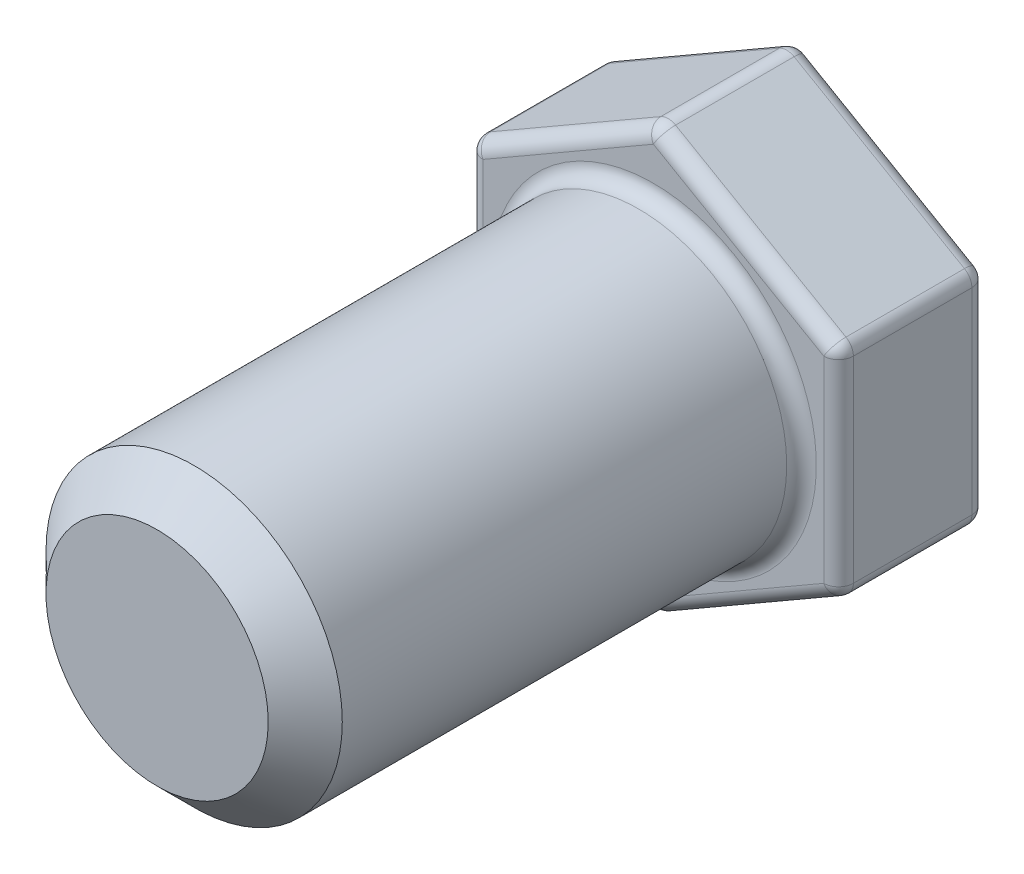
ISO-10303-21;
HEADER;
FILE_DESCRIPTION(('STEP AP214'),'2;1');
FILE_NAME('part.step','',(''),(''),'','','');
FILE_SCHEMA(('AUTOMOTIVE_DESIGN { 1 0 10303 214 1 1 1 1 }'));
ENDSEC;
DATA;
#1=APPLICATION_CONTEXT('core data for automotive mechanical design processes');
#2=APPLICATION_PROTOCOL_DEFINITION('international standard','automotive_design',2000,#1);
#3=PRODUCT_CONTEXT('',#1,'mechanical');
#4=PRODUCT('Part','Part','',(#3));
#5=PRODUCT_RELATED_PRODUCT_CATEGORY('part','',(#4));
#6=PRODUCT_DEFINITION_FORMATION('','',#4);
#7=PRODUCT_DEFINITION_CONTEXT('part definition',#1,'design');
#8=PRODUCT_DEFINITION('design','',#6,#7);
#9=PRODUCT_DEFINITION_SHAPE('','',#8);
#10=(LENGTH_UNIT() NAMED_UNIT(*) SI_UNIT(.MILLI.,.METRE.));
#11=(NAMED_UNIT(*) PLANE_ANGLE_UNIT() SI_UNIT($,.RADIAN.));
#12=(NAMED_UNIT(*) SI_UNIT($,.STERADIAN.) SOLID_ANGLE_UNIT());
#13=UNCERTAINTY_MEASURE_WITH_UNIT(LENGTH_MEASURE(1.E-05),#10,'distance_accuracy_value','');
#14=(GEOMETRIC_REPRESENTATION_CONTEXT(3) GLOBAL_UNCERTAINTY_ASSIGNED_CONTEXT((#13)) GLOBAL_UNIT_ASSIGNED_CONTEXT((#10,
#11,#12)) REPRESENTATION_CONTEXT('',''));
#15=CARTESIAN_POINT('',(0.,0.,0.));
#16=DIRECTION('',(0.,0.,1.));
#17=DIRECTION('',(1.,0.,0.));
#18=AXIS2_PLACEMENT_3D('',#15,#16,#17);
#19=CARTESIAN_POINT('',(0.,0.,6.7));
#20=DIRECTION('',(0.,0.,-1.));
#21=DIRECTION('',(-1.,0.,0.));
#22=AXIS2_PLACEMENT_3D('',#19,#20,#21);
#23=CYLINDRICAL_SURFACE('',#22,2.);
#24=CARTESIAN_POINT('',(0.,0.,6.2));
#25=DIRECTION('',(0.,0.,1.));
#26=DIRECTION('',(1.,0.,0.));
#27=AXIS2_PLACEMENT_3D('',#24,#25,#26);
#28=CIRCLE('',#27,2.);
#29=CARTESIAN_POINT('',(2.,0.,6.2));
#30=VERTEX_POINT('',#29);
#31=EDGE_CURVE('E11',#30,#30,#28,.F.);
#32=ORIENTED_EDGE('',*,*,#31,.T.);
#33=EDGE_LOOP('',(#32));
#34=FACE_BOUND('',#33,.T.);
#35=CARTESIAN_POINT('',(0.,0.,0.2));
#36=DIRECTION('',(0.,0.,-1.));
#37=DIRECTION('',(-1.,0.,0.));
#38=AXIS2_PLACEMENT_3D('',#35,#36,#37);
#39=CIRCLE('',#38,2.);
#40=CARTESIAN_POINT('',(-2.,0.,0.2));
#41=VERTEX_POINT('',#40);
#42=EDGE_CURVE('E768',#41,#41,#39,.F.);
#43=ORIENTED_EDGE('',*,*,#42,.T.);
#44=EDGE_LOOP('',(#43));
#45=FACE_BOUND('',#44,.T.);
#46=ADVANCED_FACE('F34',(#34,#45),#23,.T.);
#47=CARTESIAN_POINT('',(0.,0.,6.7));
#48=DIRECTION('',(0.,0.,1.));
#49=DIRECTION('',(1.,0.,0.));
#50=AXIS2_PLACEMENT_3D('',#47,#48,#49);
#51=PLANE('',#50);
#52=CARTESIAN_POINT('',(0.,0.,6.7));
#53=DIRECTION('',(0.,0.,1.));
#54=DIRECTION('',(1.,0.,0.));
#55=AXIS2_PLACEMENT_3D('',#52,#53,#54);
#56=CIRCLE('',#55,1.5);
#57=CARTESIAN_POINT('',(1.5,0.,6.7));
#58=VERTEX_POINT('',#57);
#59=EDGE_CURVE('E42',#58,#58,#56,.T.);
#60=ORIENTED_EDGE('',*,*,#59,.T.);
#61=EDGE_LOOP('',(#60));
#62=FACE_BOUND('',#61,.T.);
#63=ADVANCED_FACE('F296',(#62),#51,.T.);
#64=CARTESIAN_POINT('',(0.,2.88675134594813,-2.));
#65=DIRECTION('',(-0.5,-0.866025403784438,0.));
#66=DIRECTION('',(0.866025403784438,-0.5,0.));
#67=AXIS2_PLACEMENT_3D('',#64,#65,#66);
#68=PLANE('',#67);
#69=DIRECTION('',(0.866025403784438,-0.5,0.));
#70=VECTOR('',#69,1.);
#71=CARTESIAN_POINT('',(0.,2.88675134594813,-1.8));
#72=LINE('',#71,#70);
#73=CARTESIAN_POINT('',(2.4,1.50111069989303,-1.8));
#74=VERTEX_POINT('',#73);
#75=CARTESIAN_POINT('',(0.100000000000001,2.82901631902917,-1.8));
#76=VERTEX_POINT('',#75);
#77=EDGE_CURVE('E762',#74,#76,#72,.F.);
#78=ORIENTED_EDGE('',*,*,#77,.T.);
#79=DIRECTION('',(0.,0.,1.));
#80=VECTOR('',#79,1.);
#81=CARTESIAN_POINT('',(0.100000000000001,2.82901631902917,-2.));
#82=LINE('',#81,#80);
#83=CARTESIAN_POINT('',(0.100000000000001,2.82901631902917,-0.2));
#84=VERTEX_POINT('',#83);
#85=EDGE_CURVE('E241',#76,#84,#82,.T.);
#86=ORIENTED_EDGE('',*,*,#85,.T.);
#87=DIRECTION('',(0.866025403784438,-0.5,0.));
#88=VECTOR('',#87,1.);
#89=CARTESIAN_POINT('',(0.,2.88675134594813,-0.2));
#90=LINE('',#89,#88);
#91=CARTESIAN_POINT('',(2.4,1.50111069989303,-0.2));
#92=VERTEX_POINT('',#91);
#93=EDGE_CURVE('E779',#84,#92,#90,.T.);
#94=ORIENTED_EDGE('',*,*,#93,.T.);
#95=DIRECTION('',(0.,0.,1.));
#96=VECTOR('',#95,1.);
#97=CARTESIAN_POINT('',(2.4,1.50111069989303,-2.));
#98=LINE('',#97,#96);
#99=EDGE_CURVE('E239',#92,#74,#98,.F.);
#100=ORIENTED_EDGE('',*,*,#99,.T.);
#101=EDGE_LOOP('',(#78,#86,#94,#100));
#102=FACE_BOUND('',#101,.T.);
#103=ADVANCED_FACE('F314',(#102),#68,.F.);
#104=CARTESIAN_POINT('',(2.5,1.44337567297406,-2.));
#105=DIRECTION('',(-1.,0.,0.));
#106=DIRECTION('',(0.,-1.,0.));
#107=AXIS2_PLACEMENT_3D('',#104,#105,#106);
#108=PLANE('',#107);
#109=DIRECTION('',(0.,-1.,0.));
#110=VECTOR('',#109,1.);
#111=CARTESIAN_POINT('',(2.5,1.44337567297406,-0.2));
#112=LINE('',#111,#110);
#113=CARTESIAN_POINT('',(2.5,1.32790561913614,-0.2));
#114=VERTEX_POINT('',#113);
#115=CARTESIAN_POINT('',(2.5,-1.32790561913614,-0.2));
#116=VERTEX_POINT('',#115);
#117=EDGE_CURVE('E164',#114,#116,#112,.T.);
#118=ORIENTED_EDGE('',*,*,#117,.T.);
#119=DIRECTION('',(0.,0.,1.));
#120=VECTOR('',#119,1.);
#121=CARTESIAN_POINT('',(2.5,-1.32790561913614,-2.));
#122=LINE('',#121,#120);
#123=CARTESIAN_POINT('',(2.5,-1.32790561913614,-1.8));
#124=VERTEX_POINT('',#123);
#125=EDGE_CURVE('E260',#116,#124,#122,.F.);
#126=ORIENTED_EDGE('',*,*,#125,.T.);
#127=DIRECTION('',(0.,-1.,0.));
#128=VECTOR('',#127,1.);
#129=CARTESIAN_POINT('',(2.5,1.44337567297406,-1.8));
#130=LINE('',#129,#128);
#131=CARTESIAN_POINT('',(2.5,1.32790561913614,-1.8));
#132=VERTEX_POINT('',#131);
#133=EDGE_CURVE('E269',#124,#132,#130,.F.);
#134=ORIENTED_EDGE('',*,*,#133,.T.);
#135=DIRECTION('',(0.,0.,1.));
#136=VECTOR('',#135,1.);
#137=CARTESIAN_POINT('',(2.5,1.32790561913614,-2.));
#138=LINE('',#137,#136);
#139=EDGE_CURVE('E56',#132,#114,#138,.T.);
#140=ORIENTED_EDGE('',*,*,#139,.T.);
#141=EDGE_LOOP('',(#118,#126,#134,#140));
#142=FACE_BOUND('',#141,.T.);
#143=ADVANCED_FACE('F466',(#142),#108,.F.);
#144=CARTESIAN_POINT('',(2.5,-1.44337567297406,-2.));
#145=DIRECTION('',(-0.5,0.866025403784439,0.));
#146=DIRECTION('',(-0.866025403784439,-0.5,0.));
#147=AXIS2_PLACEMENT_3D('',#144,#145,#146);
#148=PLANE('',#147);
#149=DIRECTION('',(-0.866025403784439,-0.5,0.));
#150=VECTOR('',#149,1.);
#151=CARTESIAN_POINT('',(2.5,-1.44337567297406,-0.2));
#152=LINE('',#151,#150);
#153=CARTESIAN_POINT('',(2.4,-1.50111069989303,-0.2));
#154=VERTEX_POINT('',#153);
#155=CARTESIAN_POINT('',(0.0999999999999998,-2.82901631902917,-0.2));
#156=VERTEX_POINT('',#155);
#157=EDGE_CURVE('E799',#154,#156,#152,.T.);
#158=ORIENTED_EDGE('',*,*,#157,.T.);
#159=DIRECTION('',(0.,0.,1.));
#160=VECTOR('',#159,1.);
#161=CARTESIAN_POINT('',(0.0999999999999994,-2.82901631902917,-2.));
#162=LINE('',#161,#160);
#163=CARTESIAN_POINT('',(0.1,-2.82901631902917,-1.8));
#164=VERTEX_POINT('',#163);
#165=EDGE_CURVE('E257',#156,#164,#162,.F.);
#166=ORIENTED_EDGE('',*,*,#165,.T.);
#167=DIRECTION('',(-0.866025403784439,-0.5,0.));
#168=VECTOR('',#167,1.);
#169=CARTESIAN_POINT('',(2.5,-1.44337567297406,-1.8));
#170=LINE('',#169,#168);
#171=CARTESIAN_POINT('',(2.4,-1.50111069989303,-1.8));
#172=VERTEX_POINT('',#171);
#173=EDGE_CURVE('E192',#164,#172,#170,.F.);
#174=ORIENTED_EDGE('',*,*,#173,.T.);
#175=DIRECTION('',(0.,0.,1.));
#176=VECTOR('',#175,1.);
#177=CARTESIAN_POINT('',(2.4,-1.50111069989303,-2.));
#178=LINE('',#177,#176);
#179=EDGE_CURVE('E255',#172,#154,#178,.T.);
#180=ORIENTED_EDGE('',*,*,#179,.T.);
#181=EDGE_LOOP('',(#158,#166,#174,#180));
#182=FACE_BOUND('',#181,.T.);
#183=ADVANCED_FACE('F473',(#182),#148,.F.);
#184=CARTESIAN_POINT('',(0.,-2.88675134594813,-2.));
#185=DIRECTION('',(0.5,0.866025403784438,0.));
#186=DIRECTION('',(-0.866025403784438,0.5,0.));
#187=AXIS2_PLACEMENT_3D('',#184,#185,#186);
#188=PLANE('',#187);
#189=DIRECTION('',(-0.866025403784438,0.5,0.));
#190=VECTOR('',#189,1.);
#191=CARTESIAN_POINT('',(0.,-2.88675134594813,-0.2));
#192=LINE('',#191,#190);
#193=CARTESIAN_POINT('',(-0.1,-2.82901631902917,-0.2));
#194=VERTEX_POINT('',#193);
#195=CARTESIAN_POINT('',(-2.4,-1.50111069989303,-0.2));
#196=VERTEX_POINT('',#195);
#197=EDGE_CURVE('E793',#194,#196,#192,.T.);
#198=ORIENTED_EDGE('',*,*,#197,.T.);
#199=DIRECTION('',(0.,0.,1.));
#200=VECTOR('',#199,1.);
#201=CARTESIAN_POINT('',(-2.4,-1.50111069989303,-2.));
#202=LINE('',#201,#200);
#203=CARTESIAN_POINT('',(-2.4,-1.50111069989303,-1.8));
#204=VERTEX_POINT('',#203);
#205=EDGE_CURVE('E253',#196,#204,#202,.F.);
#206=ORIENTED_EDGE('',*,*,#205,.T.);
#207=DIRECTION('',(-0.866025403784438,0.5,0.));
#208=VECTOR('',#207,1.);
#209=CARTESIAN_POINT('',(0.,-2.88675134594813,-1.8));
#210=LINE('',#209,#208);
#211=CARTESIAN_POINT('',(-0.1,-2.82901631902917,-1.8));
#212=VERTEX_POINT('',#211);
#213=EDGE_CURVE('E796',#204,#212,#210,.F.);
#214=ORIENTED_EDGE('',*,*,#213,.T.);
#215=DIRECTION('',(0.,0.,1.));
#216=VECTOR('',#215,1.);
#217=CARTESIAN_POINT('',(-0.1,-2.82901631902917,-2.));
#218=LINE('',#217,#216);
#219=EDGE_CURVE('E251',#212,#194,#218,.T.);
#220=ORIENTED_EDGE('',*,*,#219,.T.);
#221=EDGE_LOOP('',(#198,#206,#214,#220));
#222=FACE_BOUND('',#221,.T.);
#223=ADVANCED_FACE('F480',(#222),#188,.F.);
#224=CARTESIAN_POINT('',(-2.5,-1.44337567297406,-2.));
#225=DIRECTION('',(1.,0.,0.));
#226=DIRECTION('',(0.,1.,0.));
#227=AXIS2_PLACEMENT_3D('',#224,#225,#226);
#228=PLANE('',#227);
#229=DIRECTION('',(0.,1.,0.));
#230=VECTOR('',#229,1.);
#231=CARTESIAN_POINT('',(-2.5,-1.44337567297406,-0.2));
#232=LINE('',#231,#230);
#233=CARTESIAN_POINT('',(-2.5,-1.32790561913614,-0.2));
#234=VERTEX_POINT('',#233);
#235=CARTESIAN_POINT('',(-2.5,1.32790561913614,-0.2));
#236=VERTEX_POINT('',#235);
#237=EDGE_CURVE('E787',#234,#236,#232,.T.);
#238=ORIENTED_EDGE('',*,*,#237,.T.);
#239=DIRECTION('',(0.,0.,1.));
#240=VECTOR('',#239,1.);
#241=CARTESIAN_POINT('',(-2.5,1.32790561913614,-2.));
#242=LINE('',#241,#240);
#243=CARTESIAN_POINT('',(-2.5,1.32790561913614,-1.8));
#244=VERTEX_POINT('',#243);
#245=EDGE_CURVE('E249',#236,#244,#242,.F.);
#246=ORIENTED_EDGE('',*,*,#245,.T.);
#247=DIRECTION('',(0.,1.,0.));
#248=VECTOR('',#247,1.);
#249=CARTESIAN_POINT('',(-2.5,-1.44337567297406,-1.8));
#250=LINE('',#249,#248);
#251=CARTESIAN_POINT('',(-2.5,-1.32790561913614,-1.8));
#252=VERTEX_POINT('',#251);
#253=EDGE_CURVE('E790',#244,#252,#250,.F.);
#254=ORIENTED_EDGE('',*,*,#253,.T.);
#255=DIRECTION('',(0.,0.,1.));
#256=VECTOR('',#255,1.);
#257=CARTESIAN_POINT('',(-2.5,-1.32790561913614,-2.));
#258=LINE('',#257,#256);
#259=EDGE_CURVE('E247',#252,#234,#258,.T.);
#260=ORIENTED_EDGE('',*,*,#259,.T.);
#261=EDGE_LOOP('',(#238,#246,#254,#260));
#262=FACE_BOUND('',#261,.T.);
#263=ADVANCED_FACE('F488',(#262),#228,.F.);
#264=CARTESIAN_POINT('',(-2.5,1.44337567297406,-2.));
#265=DIRECTION('',(0.5,-0.866025403784439,0.));
#266=DIRECTION('',(0.866025403784439,0.5,0.));
#267=AXIS2_PLACEMENT_3D('',#264,#265,#266);
#268=PLANE('',#267);
#269=DIRECTION('',(0.866025403784439,0.5,0.));
#270=VECTOR('',#269,1.);
#271=CARTESIAN_POINT('',(-2.5,1.44337567297406,-0.2));
#272=LINE('',#271,#270);
#273=CARTESIAN_POINT('',(-2.4,1.50111069989303,-0.2));
#274=VERTEX_POINT('',#273);
#275=CARTESIAN_POINT('',(-0.099999999999999,2.82901631902917,-0.2));
#276=VERTEX_POINT('',#275);
#277=EDGE_CURVE('E782',#274,#276,#272,.T.);
#278=ORIENTED_EDGE('',*,*,#277,.T.);
#279=DIRECTION('',(0.,0.,1.));
#280=VECTOR('',#279,1.);
#281=CARTESIAN_POINT('',(-0.099999999999999,2.82901631902917,-2.));
#282=LINE('',#281,#280);
#283=CARTESIAN_POINT('',(-0.0999999999999985,2.82901631902917,-1.8));
#284=VERTEX_POINT('',#283);
#285=EDGE_CURVE('E245',#276,#284,#282,.F.);
#286=ORIENTED_EDGE('',*,*,#285,.T.);
#287=DIRECTION('',(0.866025403784439,0.5,0.));
#288=VECTOR('',#287,1.);
#289=CARTESIAN_POINT('',(-2.5,1.44337567297406,-1.8));
#290=LINE('',#289,#288);
#291=CARTESIAN_POINT('',(-2.4,1.50111069989303,-1.8));
#292=VERTEX_POINT('',#291);
#293=EDGE_CURVE('E785',#284,#292,#290,.F.);
#294=ORIENTED_EDGE('',*,*,#293,.T.);
#295=DIRECTION('',(0.,0.,1.));
#296=VECTOR('',#295,1.);
#297=CARTESIAN_POINT('',(-2.4,1.50111069989303,-2.));
#298=LINE('',#297,#296);
#299=EDGE_CURVE('E243',#292,#274,#298,.T.);
#300=ORIENTED_EDGE('',*,*,#299,.T.);
#301=EDGE_LOOP('',(#278,#286,#294,#300));
#302=FACE_BOUND('',#301,.T.);
#303=ADVANCED_FACE('F496',(#302),#268,.F.);
#304=CARTESIAN_POINT('',(0.,0.,-2.));
#305=DIRECTION('',(0.,0.,-1.));
#306=DIRECTION('',(-1.,0.,0.));
#307=AXIS2_PLACEMENT_3D('',#304,#305,#306);
#308=PLANE('',#307);
#309=DIRECTION('',(0.,1.,0.));
#310=VECTOR('',#309,1.);
#311=CARTESIAN_POINT('',(-2.3,1.44337567297406,-2.));
#312=LINE('',#311,#310);
#313=CARTESIAN_POINT('',(-2.3,-1.32790561913614,-2.));
#314=VERTEX_POINT('',#313);
#315=CARTESIAN_POINT('',(-2.3,1.32790561913614,-2.));
#316=VERTEX_POINT('',#315);
#317=EDGE_CURVE('E733',#314,#316,#312,.T.);
#318=ORIENTED_EDGE('',*,*,#317,.T.);
#319=DIRECTION('',(0.866025403784439,0.5,0.));
#320=VECTOR('',#319,1.);
#321=CARTESIAN_POINT('',(0.100000000000001,2.71354626519124,-2.));
#322=LINE('',#321,#320);
#323=CARTESIAN_POINT('',(0.,2.65581123827228,-2.));
#324=VERTEX_POINT('',#323);
#325=EDGE_CURVE('E736',#316,#324,#322,.T.);
#326=ORIENTED_EDGE('',*,*,#325,.T.);
#327=DIRECTION('',(0.866025403784438,-0.5,0.));
#328=VECTOR('',#327,1.);
#329=CARTESIAN_POINT('',(2.4,1.27017059221718,-2.));
#330=LINE('',#329,#328);
#331=CARTESIAN_POINT('',(2.3,1.32790561913614,-2.));
#332=VERTEX_POINT('',#331);
#333=EDGE_CURVE('E760',#324,#332,#330,.T.);
#334=ORIENTED_EDGE('',*,*,#333,.T.);
#335=DIRECTION('',(0.,-1.,0.));
#336=VECTOR('',#335,1.);
#337=CARTESIAN_POINT('',(2.3,-1.44337567297406,-2.));
#338=LINE('',#337,#336);
#339=CARTESIAN_POINT('',(2.3,-1.32790561913614,-2.));
#340=VERTEX_POINT('',#339);
#341=EDGE_CURVE('E766',#332,#340,#338,.T.);
#342=ORIENTED_EDGE('',*,*,#341,.T.);
#343=DIRECTION('',(-0.866025403784439,-0.5,0.));
#344=VECTOR('',#343,1.);
#345=CARTESIAN_POINT('',(-0.1,-2.71354626519124,-2.));
#346=LINE('',#345,#344);
#347=CARTESIAN_POINT('',(0.,-2.65581123827228,-2.));
#348=VERTEX_POINT('',#347);
#349=EDGE_CURVE('E772',#340,#348,#346,.T.);
#350=ORIENTED_EDGE('',*,*,#349,.T.);
#351=DIRECTION('',(-0.866025403784438,0.5,0.));
#352=VECTOR('',#351,1.);
#353=CARTESIAN_POINT('',(-2.4,-1.27017059221718,-2.));
#354=LINE('',#353,#352);
#355=EDGE_CURVE('E739',#348,#314,#354,.T.);
#356=ORIENTED_EDGE('',*,*,#355,.T.);
#357=EDGE_LOOP('',(#318,#326,#334,#342,#350,#356));
#358=FACE_BOUND('',#357,.T.);
#359=ADVANCED_FACE('F504',(#358),#308,.T.);
#360=CARTESIAN_POINT('',(0.,0.,0.));
#361=DIRECTION('',(0.,0.,-1.));
#362=DIRECTION('',(-1.,0.,0.));
#363=AXIS2_PLACEMENT_3D('',#360,#361,#362);
#364=PLANE('',#363);
#365=DIRECTION('',(-0.866025403784439,-0.5,0.));
#366=VECTOR('',#365,1.);
#367=CARTESIAN_POINT('',(1.15,-1.99185842870421,0.));
#368=LINE('',#367,#366);
#369=CARTESIAN_POINT('',(0.,-2.65581123827228,0.));
#370=VERTEX_POINT('',#369);
#371=CARTESIAN_POINT('',(2.3,-1.32790561913614,0.));
#372=VERTEX_POINT('',#371);
#373=EDGE_CURVE('E191',#370,#372,#368,.F.);
#374=ORIENTED_EDGE('',*,*,#373,.T.);
#375=DIRECTION('',(0.,-1.,0.));
#376=VECTOR('',#375,1.);
#377=CARTESIAN_POINT('',(2.3,0.,0.));
#378=LINE('',#377,#376);
#379=CARTESIAN_POINT('',(2.3,1.32790561913614,0.));
#380=VERTEX_POINT('',#379);
#381=EDGE_CURVE('E163',#372,#380,#378,.F.);
#382=ORIENTED_EDGE('',*,*,#381,.T.);
#383=DIRECTION('',(0.866025403784438,-0.5,0.));
#384=VECTOR('',#383,1.);
#385=CARTESIAN_POINT('',(1.15,1.99185842870421,0.));
#386=LINE('',#385,#384);
#387=CARTESIAN_POINT('',(0.,2.65581123827228,0.));
#388=VERTEX_POINT('',#387);
#389=EDGE_CURVE('E173',#380,#388,#386,.F.);
#390=ORIENTED_EDGE('',*,*,#389,.T.);
#391=DIRECTION('',(0.866025403784439,0.5,0.));
#392=VECTOR('',#391,1.);
#393=CARTESIAN_POINT('',(-1.15,1.99185842870421,0.));
#394=LINE('',#393,#392);
#395=CARTESIAN_POINT('',(-2.3,1.32790561913614,0.));
#396=VERTEX_POINT('',#395);
#397=EDGE_CURVE('E183',#388,#396,#394,.F.);
#398=ORIENTED_EDGE('',*,*,#397,.T.);
#399=DIRECTION('',(0.,1.,0.));
#400=VECTOR('',#399,1.);
#401=CARTESIAN_POINT('',(-2.3,0.,0.));
#402=LINE('',#401,#400);
#403=CARTESIAN_POINT('',(-2.3,-1.32790561913614,0.));
#404=VERTEX_POINT('',#403);
#405=EDGE_CURVE('E807',#396,#404,#402,.F.);
#406=ORIENTED_EDGE('',*,*,#405,.T.);
#407=DIRECTION('',(-0.866025403784438,0.5,0.));
#408=VECTOR('',#407,1.);
#409=CARTESIAN_POINT('',(-1.15,-1.99185842870421,0.));
#410=LINE('',#409,#408);
#411=EDGE_CURVE('E805',#404,#370,#410,.F.);
#412=ORIENTED_EDGE('',*,*,#411,.T.);
#413=EDGE_LOOP('',(#374,#382,#390,#398,#406,#412));
#414=FACE_BOUND('',#413,.T.);
#415=CARTESIAN_POINT('',(0.,0.,0.));
#416=DIRECTION('',(0.,0.,-1.));
#417=DIRECTION('',(-1.,0.,0.));
#418=AXIS2_PLACEMENT_3D('',#415,#416,#417);
#419=CIRCLE('',#418,2.2);
#420=CARTESIAN_POINT('',(-2.2,0.,0.));
#421=VERTEX_POINT('',#420);
#422=EDGE_CURVE('E184',#421,#421,#419,.T.);
#423=ORIENTED_EDGE('',*,*,#422,.T.);
#424=EDGE_LOOP('',(#423));
#425=FACE_BOUND('',#424,.T.);
#426=ADVANCED_FACE('F187',(#414,#425),#364,.F.);
#427=CARTESIAN_POINT('',(-2.3,-1.44337567297406,-0.2));
#428=DIRECTION('',(0.,1.,0.));
#429=DIRECTION('',(-1.,0.,0.));
#430=AXIS2_PLACEMENT_3D('',#427,#428,#429);
#431=CYLINDRICAL_SURFACE('',#430,0.2);
#432=ORIENTED_EDGE('',*,*,#405,.F.);
#433=CARTESIAN_POINT('',(-2.3,1.32790561913614,-0.2));
#434=DIRECTION('',(0.,1.,0.));
#435=DIRECTION('',(-1.,0.,0.));
#436=AXIS2_PLACEMENT_3D('',#433,#434,#435);
#437=CIRCLE('',#436,0.2);
#438=EDGE_CURVE('E215',#396,#236,#437,.F.);
#439=ORIENTED_EDGE('',*,*,#438,.T.);
#440=ORIENTED_EDGE('',*,*,#237,.F.);
#441=CARTESIAN_POINT('',(-2.3,-1.32790561913614,-0.2));
#442=DIRECTION('',(0.,1.,0.));
#443=DIRECTION('',(-1.,0.,0.));
#444=AXIS2_PLACEMENT_3D('',#441,#442,#443);
#445=CIRCLE('',#444,0.2);
#446=EDGE_CURVE('E213',#234,#404,#445,.T.);
#447=ORIENTED_EDGE('',*,*,#446,.T.);
#448=EDGE_LOOP('',(#432,#439,#440,#447));
#449=FACE_BOUND('',#448,.T.);
#450=ADVANCED_FACE('F335',(#449),#431,.T.);
#451=CARTESIAN_POINT('',(-2.4,1.27017059221718,-0.2));
#452=DIRECTION('',(0.866025403784439,0.5,0.));
#453=DIRECTION('',(-0.5,0.866025403784439,0.));
#454=AXIS2_PLACEMENT_3D('',#451,#452,#453);
#455=CYLINDRICAL_SURFACE('',#454,0.2);
#456=ORIENTED_EDGE('',*,*,#397,.F.);
#457=CARTESIAN_POINT('',(0.,2.65581123827228,-0.2));
#458=DIRECTION('',(0.866025403784439,0.5,0.));
#459=DIRECTION('',(-0.5,0.866025403784439,0.));
#460=AXIS2_PLACEMENT_3D('',#457,#458,#459);
#461=CIRCLE('',#460,0.2);
#462=EDGE_CURVE('E206',#388,#276,#461,.F.);
#463=ORIENTED_EDGE('',*,*,#462,.T.);
#464=ORIENTED_EDGE('',*,*,#277,.F.);
#465=CARTESIAN_POINT('',(-2.3,1.32790561913614,-0.2));
#466=DIRECTION('',(0.866025403784439,0.5,0.));
#467=DIRECTION('',(-0.5,0.866025403784439,0.));
#468=AXIS2_PLACEMENT_3D('',#465,#466,#467);
#469=CIRCLE('',#468,0.2);
#470=EDGE_CURVE('E199',#274,#396,#469,.T.);
#471=ORIENTED_EDGE('',*,*,#470,.T.);
#472=EDGE_LOOP('',(#456,#463,#464,#471));
#473=FACE_BOUND('',#472,.T.);
#474=ADVANCED_FACE('F331',(#473),#455,.T.);
#475=CARTESIAN_POINT('',(0.0999999999999997,-2.71354626519124,-0.2));
#476=DIRECTION('',(-0.866025403784438,0.5,0.));
#477=DIRECTION('',(-0.5,-0.866025403784438,0.));
#478=AXIS2_PLACEMENT_3D('',#475,#476,#477);
#479=CYLINDRICAL_SURFACE('',#478,0.2);
#480=ORIENTED_EDGE('',*,*,#411,.F.);
#481=CARTESIAN_POINT('',(-2.3,-1.32790561913614,-0.2));
#482=DIRECTION('',(-0.866025403784438,0.5,0.));
#483=DIRECTION('',(-0.5,-0.866025403784438,0.));
#484=AXIS2_PLACEMENT_3D('',#481,#482,#483);
#485=CIRCLE('',#484,0.2);
#486=EDGE_CURVE('E224',#404,#196,#485,.F.);
#487=ORIENTED_EDGE('',*,*,#486,.T.);
#488=ORIENTED_EDGE('',*,*,#197,.F.);
#489=CARTESIAN_POINT('',(0.,-2.65581123827228,-0.2));
#490=DIRECTION('',(-0.866025403784438,0.5,0.));
#491=DIRECTION('',(-0.5,-0.866025403784438,0.));
#492=AXIS2_PLACEMENT_3D('',#489,#490,#491);
#493=CIRCLE('',#492,0.2);
#494=EDGE_CURVE('E222',#194,#370,#493,.T.);
#495=ORIENTED_EDGE('',*,*,#494,.T.);
#496=EDGE_LOOP('',(#480,#487,#488,#495));
#497=FACE_BOUND('',#496,.T.);
#498=ADVANCED_FACE('F328',(#497),#479,.T.);
#499=CARTESIAN_POINT('',(-0.0999999999999992,2.71354626519124,-0.2));
#500=DIRECTION('',(0.866025403784438,-0.5,0.));
#501=DIRECTION('',(0.5,0.866025403784438,0.));
#502=AXIS2_PLACEMENT_3D('',#499,#500,#501);
#503=CYLINDRICAL_SURFACE('',#502,0.2);
#504=ORIENTED_EDGE('',*,*,#93,.F.);
#505=CARTESIAN_POINT('',(0.,2.65581123827228,-0.2));
#506=DIRECTION('',(0.866025403784438,-0.5,0.));
#507=DIRECTION('',(0.5,0.866025403784438,0.));
#508=AXIS2_PLACEMENT_3D('',#505,#506,#507);
#509=CIRCLE('',#508,0.2);
#510=EDGE_CURVE('E179',#84,#388,#509,.T.);
#511=ORIENTED_EDGE('',*,*,#510,.T.);
#512=ORIENTED_EDGE('',*,*,#389,.F.);
#513=CARTESIAN_POINT('',(2.3,1.32790561913614,-0.2));
#514=DIRECTION('',(0.866025403784438,-0.5,0.));
#515=DIRECTION('',(0.5,0.866025403784438,0.));
#516=AXIS2_PLACEMENT_3D('',#513,#514,#515);
#517=CIRCLE('',#516,0.2);
#518=EDGE_CURVE('E176',#380,#92,#517,.F.);
#519=ORIENTED_EDGE('',*,*,#518,.T.);
#520=EDGE_LOOP('',(#504,#511,#512,#519));
#521=FACE_BOUND('',#520,.T.);
#522=ADVANCED_FACE('F175',(#521),#503,.T.);
#523=CARTESIAN_POINT('',(2.4,-1.27017059221718,-0.2));
#524=DIRECTION('',(-0.866025403784439,-0.5,0.));
#525=DIRECTION('',(0.5,-0.866025403784439,0.));
#526=AXIS2_PLACEMENT_3D('',#523,#524,#525);
#527=CYLINDRICAL_SURFACE('',#526,0.2);
#528=ORIENTED_EDGE('',*,*,#373,.F.);
#529=CARTESIAN_POINT('',(0.,-2.65581123827228,-0.2));
#530=DIRECTION('',(-0.866025403784439,-0.5,0.));
#531=DIRECTION('',(0.5,-0.866025403784439,0.));
#532=AXIS2_PLACEMENT_3D('',#529,#530,#531);
#533=CIRCLE('',#532,0.2);
#534=EDGE_CURVE('E232',#370,#156,#533,.F.);
#535=ORIENTED_EDGE('',*,*,#534,.T.);
#536=ORIENTED_EDGE('',*,*,#157,.F.);
#537=CARTESIAN_POINT('',(2.3,-1.32790561913614,-0.2));
#538=DIRECTION('',(-0.866025403784439,-0.5,0.));
#539=DIRECTION('',(0.5,-0.866025403784439,0.));
#540=AXIS2_PLACEMENT_3D('',#537,#538,#539);
#541=CIRCLE('',#540,0.2);
#542=EDGE_CURVE('E230',#154,#372,#541,.T.);
#543=ORIENTED_EDGE('',*,*,#542,.T.);
#544=EDGE_LOOP('',(#528,#535,#536,#543));
#545=FACE_BOUND('',#544,.T.);
#546=ADVANCED_FACE('F322',(#545),#527,.T.);
#547=CARTESIAN_POINT('',(2.3,1.44337567297406,-0.2));
#548=DIRECTION('',(0.,-1.,0.));
#549=DIRECTION('',(1.,0.,0.));
#550=AXIS2_PLACEMENT_3D('',#547,#548,#549);
#551=CYLINDRICAL_SURFACE('',#550,0.2);
#552=ORIENTED_EDGE('',*,*,#381,.F.);
#553=CARTESIAN_POINT('',(2.3,-1.32790561913614,-0.2));
#554=DIRECTION('',(0.,-1.,0.));
#555=DIRECTION('',(1.,0.,0.));
#556=AXIS2_PLACEMENT_3D('',#553,#554,#555);
#557=CIRCLE('',#556,0.2);
#558=EDGE_CURVE('E49',#372,#116,#557,.F.);
#559=ORIENTED_EDGE('',*,*,#558,.T.);
#560=ORIENTED_EDGE('',*,*,#117,.F.);
#561=CARTESIAN_POINT('',(2.3,1.32790561913614,-0.2));
#562=DIRECTION('',(0.,-1.,0.));
#563=DIRECTION('',(1.,0.,0.));
#564=AXIS2_PLACEMENT_3D('',#561,#562,#563);
#565=CIRCLE('',#564,0.2);
#566=EDGE_CURVE('E159',#114,#380,#565,.T.);
#567=ORIENTED_EDGE('',*,*,#566,.T.);
#568=EDGE_LOOP('',(#552,#559,#560,#567));
#569=FACE_BOUND('',#568,.T.);
#570=ADVANCED_FACE('F161',(#569),#551,.T.);
#571=CARTESIAN_POINT('',(0.,0.,0.2));
#572=DIRECTION('',(0.,0.,-1.));
#573=DIRECTION('',(-1.,0.,0.));
#574=AXIS2_PLACEMENT_3D('',#571,#572,#573);
#575=TOROIDAL_SURFACE('',#574,2.2,0.2);
#576=ORIENTED_EDGE('',*,*,#42,.F.);
#577=EDGE_LOOP('',(#576));
#578=FACE_BOUND('',#577,.T.);
#579=ORIENTED_EDGE('',*,*,#422,.F.);
#580=EDGE_LOOP('',(#579));
#581=FACE_BOUND('',#580,.T.);
#582=ADVANCED_FACE('F321',(#578,#581),#575,.F.);
#583=CARTESIAN_POINT('',(1.15,-1.99185842870421,-1.8));
#584=DIRECTION('',(0.866025403784439,0.5,0.));
#585=DIRECTION('',(-0.5,0.866025403784439,0.));
#586=AXIS2_PLACEMENT_3D('',#583,#584,#585);
#587=CYLINDRICAL_SURFACE('',#586,0.2);
#588=ORIENTED_EDGE('',*,*,#173,.F.);
#589=CARTESIAN_POINT('',(0.,-2.65581123827228,-1.8));
#590=DIRECTION('',(0.866025403784439,0.5,0.));
#591=DIRECTION('',(-0.5,0.866025403784439,0.));
#592=AXIS2_PLACEMENT_3D('',#589,#590,#591);
#593=CIRCLE('',#592,0.2);
#594=EDGE_CURVE('E228',#164,#348,#593,.T.);
#595=ORIENTED_EDGE('',*,*,#594,.T.);
#596=ORIENTED_EDGE('',*,*,#349,.F.);
#597=CARTESIAN_POINT('',(2.3,-1.32790561913614,-1.8));
#598=DIRECTION('',(0.866025403784439,0.5,0.));
#599=DIRECTION('',(-0.5,0.866025403784439,0.));
#600=AXIS2_PLACEMENT_3D('',#597,#598,#599);
#601=CIRCLE('',#600,0.2);
#602=EDGE_CURVE('E226',#340,#172,#601,.F.);
#603=ORIENTED_EDGE('',*,*,#602,.T.);
#604=EDGE_LOOP('',(#588,#595,#596,#603));
#605=FACE_BOUND('',#604,.T.);
#606=ADVANCED_FACE('F342',(#605),#587,.T.);
#607=CARTESIAN_POINT('',(-1.15,-1.99185842870421,-1.8));
#608=DIRECTION('',(0.866025403784438,-0.5,0.));
#609=DIRECTION('',(0.5,0.866025403784438,0.));
#610=AXIS2_PLACEMENT_3D('',#607,#608,#609);
#611=CYLINDRICAL_SURFACE('',#610,0.2);
#612=ORIENTED_EDGE('',*,*,#213,.F.);
#613=CARTESIAN_POINT('',(-2.3,-1.32790561913614,-1.8));
#614=DIRECTION('',(0.866025403784438,-0.5,0.));
#615=DIRECTION('',(0.5,0.866025403784438,0.));
#616=AXIS2_PLACEMENT_3D('',#613,#614,#615);
#617=CIRCLE('',#616,0.2);
#618=EDGE_CURVE('E220',#204,#314,#617,.T.);
#619=ORIENTED_EDGE('',*,*,#618,.T.);
#620=ORIENTED_EDGE('',*,*,#355,.F.);
#621=CARTESIAN_POINT('',(0.,-2.65581123827228,-1.8));
#622=DIRECTION('',(0.866025403784438,-0.5,0.));
#623=DIRECTION('',(0.5,0.866025403784438,0.));
#624=AXIS2_PLACEMENT_3D('',#621,#622,#623);
#625=CIRCLE('',#624,0.2);
#626=EDGE_CURVE('E217',#348,#212,#625,.F.);
#627=ORIENTED_EDGE('',*,*,#626,.T.);
#628=EDGE_LOOP('',(#612,#619,#620,#627));
#629=FACE_BOUND('',#628,.T.);
#630=ADVANCED_FACE('F360',(#629),#611,.T.);
#631=CARTESIAN_POINT('',(2.3,0.,-1.8));
#632=DIRECTION('',(0.,1.,0.));
#633=DIRECTION('',(-1.,0.,0.));
#634=AXIS2_PLACEMENT_3D('',#631,#632,#633);
#635=CYLINDRICAL_SURFACE('',#634,0.2);
#636=ORIENTED_EDGE('',*,*,#133,.F.);
#637=CARTESIAN_POINT('',(2.3,-1.32790561913614,-1.8));
#638=DIRECTION('',(0.,1.,0.));
#639=DIRECTION('',(-1.,0.,0.));
#640=AXIS2_PLACEMENT_3D('',#637,#638,#639);
#641=CIRCLE('',#640,0.2);
#642=EDGE_CURVE('E169',#124,#340,#641,.T.);
#643=ORIENTED_EDGE('',*,*,#642,.T.);
#644=ORIENTED_EDGE('',*,*,#341,.F.);
#645=CARTESIAN_POINT('',(2.3,1.32790561913614,-1.8));
#646=DIRECTION('',(0.,1.,0.));
#647=DIRECTION('',(-1.,0.,0.));
#648=AXIS2_PLACEMENT_3D('',#645,#646,#647);
#649=CIRCLE('',#648,0.2);
#650=EDGE_CURVE('E234',#332,#132,#649,.F.);
#651=ORIENTED_EDGE('',*,*,#650,.T.);
#652=EDGE_LOOP('',(#636,#643,#644,#651));
#653=FACE_BOUND('',#652,.T.);
#654=ADVANCED_FACE('F356',(#653),#635,.T.);
#655=CARTESIAN_POINT('',(-2.3,0.,-1.8));
#656=DIRECTION('',(0.,-1.,0.));
#657=DIRECTION('',(1.,0.,0.));
#658=AXIS2_PLACEMENT_3D('',#655,#656,#657);
#659=CYLINDRICAL_SURFACE('',#658,0.2);
#660=ORIENTED_EDGE('',*,*,#253,.F.);
#661=CARTESIAN_POINT('',(-2.3,1.32790561913614,-1.8));
#662=DIRECTION('',(0.,-1.,0.));
#663=DIRECTION('',(1.,0.,0.));
#664=AXIS2_PLACEMENT_3D('',#661,#662,#663);
#665=CIRCLE('',#664,0.2);
#666=EDGE_CURVE('E211',#244,#316,#665,.T.);
#667=ORIENTED_EDGE('',*,*,#666,.T.);
#668=ORIENTED_EDGE('',*,*,#317,.F.);
#669=CARTESIAN_POINT('',(-2.3,-1.32790561913614,-1.8));
#670=DIRECTION('',(0.,-1.,0.));
#671=DIRECTION('',(1.,0.,0.));
#672=AXIS2_PLACEMENT_3D('',#669,#670,#671);
#673=CIRCLE('',#672,0.2);
#674=EDGE_CURVE('E208',#314,#252,#673,.F.);
#675=ORIENTED_EDGE('',*,*,#674,.T.);
#676=EDGE_LOOP('',(#660,#667,#668,#675));
#677=FACE_BOUND('',#676,.T.);
#678=ADVANCED_FACE('F352',(#677),#659,.T.);
#679=CARTESIAN_POINT('',(1.15,1.99185842870421,-1.8));
#680=DIRECTION('',(-0.866025403784438,0.5,0.));
#681=DIRECTION('',(-0.5,-0.866025403784438,0.));
#682=AXIS2_PLACEMENT_3D('',#679,#680,#681);
#683=CYLINDRICAL_SURFACE('',#682,0.2);
#684=ORIENTED_EDGE('',*,*,#333,.F.);
#685=CARTESIAN_POINT('',(0.,2.65581123827228,-1.8));
#686=DIRECTION('',(-0.866025403784438,0.5,0.));
#687=DIRECTION('',(-0.5,-0.866025403784438,0.));
#688=AXIS2_PLACEMENT_3D('',#685,#686,#687);
#689=CIRCLE('',#688,0.2);
#690=EDGE_CURVE('E197',#324,#76,#689,.F.);
#691=ORIENTED_EDGE('',*,*,#690,.T.);
#692=ORIENTED_EDGE('',*,*,#77,.F.);
#693=CARTESIAN_POINT('',(2.3,1.32790561913614,-1.8));
#694=DIRECTION('',(-0.866025403784438,0.5,0.));
#695=DIRECTION('',(-0.5,-0.866025403784438,0.));
#696=AXIS2_PLACEMENT_3D('',#693,#694,#695);
#697=CIRCLE('',#696,0.2);
#698=EDGE_CURVE('E201',#74,#332,#697,.T.);
#699=ORIENTED_EDGE('',*,*,#698,.T.);
#700=EDGE_LOOP('',(#684,#691,#692,#699));
#701=FACE_BOUND('',#700,.T.);
#702=ADVANCED_FACE('F348',(#701),#683,.T.);
#703=CARTESIAN_POINT('',(-1.15,1.99185842870421,-1.8));
#704=DIRECTION('',(-0.866025403784439,-0.5,0.));
#705=DIRECTION('',(0.5,-0.866025403784439,0.));
#706=AXIS2_PLACEMENT_3D('',#703,#704,#705);
#707=CYLINDRICAL_SURFACE('',#706,0.2);
#708=ORIENTED_EDGE('',*,*,#293,.F.);
#709=CARTESIAN_POINT('',(0.,2.65581123827228,-1.8));
#710=DIRECTION('',(-0.866025403784439,-0.5,0.));
#711=DIRECTION('',(0.5,-0.866025403784439,0.));
#712=AXIS2_PLACEMENT_3D('',#709,#710,#711);
#713=CIRCLE('',#712,0.2);
#714=EDGE_CURVE('E749',#284,#324,#713,.T.);
#715=ORIENTED_EDGE('',*,*,#714,.T.);
#716=ORIENTED_EDGE('',*,*,#325,.F.);
#717=CARTESIAN_POINT('',(-2.3,1.32790561913614,-1.8));
#718=DIRECTION('',(-0.866025403784439,-0.5,0.));
#719=DIRECTION('',(0.5,-0.866025403784439,0.));
#720=AXIS2_PLACEMENT_3D('',#717,#718,#719);
#721=CIRCLE('',#720,0.2);
#722=EDGE_CURVE('E746',#316,#292,#721,.F.);
#723=ORIENTED_EDGE('',*,*,#722,.T.);
#724=EDGE_LOOP('',(#708,#715,#716,#723));
#725=FACE_BOUND('',#724,.T.);
#726=ADVANCED_FACE('F344',(#725),#707,.T.);
#727=CARTESIAN_POINT('',(0.,2.65581123827228,-0.2));
#728=DIRECTION('',(0.,0.,1.));
#729=DIRECTION('',(1.,0.,0.));
#730=AXIS2_PLACEMENT_3D('',#727,#728,#729);
#731=SPHERICAL_SURFACE('',#730,0.2);
#732=ORIENTED_EDGE('',*,*,#462,.F.);
#733=ORIENTED_EDGE('',*,*,#510,.F.);
#734=CARTESIAN_POINT('',(0.,2.65581123827228,-0.2));
#735=DIRECTION('',(0.,0.,-1.));
#736=DIRECTION('',(-1.,0.,0.));
#737=AXIS2_PLACEMENT_3D('',#734,#735,#736);
#738=CIRCLE('',#737,0.2);
#739=EDGE_CURVE('E265',#276,#84,#738,.T.);
#740=ORIENTED_EDGE('',*,*,#739,.F.);
#741=EDGE_LOOP('',(#732,#733,#740));
#742=FACE_BOUND('',#741,.T.);
#743=ADVANCED_FACE('F347',(#742),#731,.T.);
#744=CARTESIAN_POINT('',(0.,2.65581123827228,-2.));
#745=DIRECTION('',(0.,0.,1.));
#746=DIRECTION('',(1.,0.,0.));
#747=AXIS2_PLACEMENT_3D('',#744,#745,#746);
#748=CYLINDRICAL_SURFACE('',#747,0.2);
#749=ORIENTED_EDGE('',*,*,#739,.T.);
#750=ORIENTED_EDGE('',*,*,#85,.F.);
#751=CARTESIAN_POINT('',(0.,2.65581123827228,-1.8));
#752=DIRECTION('',(0.,0.,-1.));
#753=DIRECTION('',(-1.,0.,0.));
#754=AXIS2_PLACEMENT_3D('',#751,#752,#753);
#755=CIRCLE('',#754,0.2);
#756=EDGE_CURVE('E262',#284,#76,#755,.T.);
#757=ORIENTED_EDGE('',*,*,#756,.F.);
#758=ORIENTED_EDGE('',*,*,#285,.F.);
#759=EDGE_LOOP('',(#749,#750,#757,#758));
#760=FACE_BOUND('',#759,.T.);
#761=ADVANCED_FACE('F372',(#760),#748,.T.);
#762=CARTESIAN_POINT('',(0.,2.65581123827228,-1.8));
#763=DIRECTION('',(0.,0.,1.));
#764=DIRECTION('',(1.,0.,0.));
#765=AXIS2_PLACEMENT_3D('',#762,#763,#764);
#766=SPHERICAL_SURFACE('',#765,0.2);
#767=ORIENTED_EDGE('',*,*,#756,.T.);
#768=ORIENTED_EDGE('',*,*,#690,.F.);
#769=ORIENTED_EDGE('',*,*,#714,.F.);
#770=EDGE_LOOP('',(#767,#768,#769));
#771=FACE_BOUND('',#770,.T.);
#772=ADVANCED_FACE('F368',(#771),#766,.T.);
#773=CARTESIAN_POINT('',(-2.3,1.32790561913614,-0.2));
#774=DIRECTION('',(0.,0.,1.));
#775=DIRECTION('',(1.,0.,0.));
#776=AXIS2_PLACEMENT_3D('',#773,#774,#775);
#777=SPHERICAL_SURFACE('',#776,0.2);
#778=ORIENTED_EDGE('',*,*,#438,.F.);
#779=ORIENTED_EDGE('',*,*,#470,.F.);
#780=CARTESIAN_POINT('',(-2.3,1.32790561913614,-0.2));
#781=DIRECTION('',(0.,0.,-1.));
#782=DIRECTION('',(-1.,0.,0.));
#783=AXIS2_PLACEMENT_3D('',#780,#781,#782);
#784=CIRCLE('',#783,0.2);
#785=EDGE_CURVE('E266',#236,#274,#784,.T.);
#786=ORIENTED_EDGE('',*,*,#785,.F.);
#787=EDGE_LOOP('',(#778,#779,#786));
#788=FACE_BOUND('',#787,.T.);
#789=ADVANCED_FACE('F371',(#788),#777,.T.);
#790=CARTESIAN_POINT('',(-2.3,1.32790561913614,-2.));
#791=DIRECTION('',(0.,0.,1.));
#792=DIRECTION('',(1.,0.,0.));
#793=AXIS2_PLACEMENT_3D('',#790,#791,#792);
#794=CYLINDRICAL_SURFACE('',#793,0.2);
#795=ORIENTED_EDGE('',*,*,#785,.T.);
#796=ORIENTED_EDGE('',*,*,#299,.F.);
#797=CARTESIAN_POINT('',(-2.3,1.32790561913614,-1.8));
#798=DIRECTION('',(0.,0.,-1.));
#799=DIRECTION('',(-1.,0.,0.));
#800=AXIS2_PLACEMENT_3D('',#797,#798,#799);
#801=CIRCLE('',#800,0.2);
#802=EDGE_CURVE('E270',#244,#292,#801,.T.);
#803=ORIENTED_EDGE('',*,*,#802,.F.);
#804=ORIENTED_EDGE('',*,*,#245,.F.);
#805=EDGE_LOOP('',(#795,#796,#803,#804));
#806=FACE_BOUND('',#805,.T.);
#807=ADVANCED_FACE('F384',(#806),#794,.T.);
#808=CARTESIAN_POINT('',(-2.3,1.32790561913614,-1.8));
#809=DIRECTION('',(0.,0.,1.));
#810=DIRECTION('',(1.,0.,0.));
#811=AXIS2_PLACEMENT_3D('',#808,#809,#810);
#812=SPHERICAL_SURFACE('',#811,0.2);
#813=ORIENTED_EDGE('',*,*,#722,.F.);
#814=ORIENTED_EDGE('',*,*,#666,.F.);
#815=ORIENTED_EDGE('',*,*,#802,.T.);
#816=EDGE_LOOP('',(#813,#814,#815));
#817=FACE_BOUND('',#816,.T.);
#818=ADVANCED_FACE('F380',(#817),#812,.T.);
#819=CARTESIAN_POINT('',(-2.3,-1.32790561913614,-0.2));
#820=DIRECTION('',(0.,0.,1.));
#821=DIRECTION('',(1.,0.,0.));
#822=AXIS2_PLACEMENT_3D('',#819,#820,#821);
#823=SPHERICAL_SURFACE('',#822,0.2);
#824=ORIENTED_EDGE('',*,*,#486,.F.);
#825=ORIENTED_EDGE('',*,*,#446,.F.);
#826=CARTESIAN_POINT('',(-2.3,-1.32790561913614,-0.2));
#827=DIRECTION('',(0.,0.,-1.));
#828=DIRECTION('',(-1.,0.,0.));
#829=AXIS2_PLACEMENT_3D('',#826,#827,#828);
#830=CIRCLE('',#829,0.2);
#831=EDGE_CURVE('E272',#196,#234,#830,.T.);
#832=ORIENTED_EDGE('',*,*,#831,.F.);
#833=EDGE_LOOP('',(#824,#825,#832));
#834=FACE_BOUND('',#833,.T.);
#835=ADVANCED_FACE('F383',(#834),#823,.T.);
#836=CARTESIAN_POINT('',(-2.3,-1.32790561913614,-2.));
#837=DIRECTION('',(0.,0.,1.));
#838=DIRECTION('',(1.,0.,0.));
#839=AXIS2_PLACEMENT_3D('',#836,#837,#838);
#840=CYLINDRICAL_SURFACE('',#839,0.2);
#841=ORIENTED_EDGE('',*,*,#831,.T.);
#842=ORIENTED_EDGE('',*,*,#259,.F.);
#843=CARTESIAN_POINT('',(-2.3,-1.32790561913614,-1.8));
#844=DIRECTION('',(0.,0.,-1.));
#845=DIRECTION('',(-1.,0.,0.));
#846=AXIS2_PLACEMENT_3D('',#843,#844,#845);
#847=CIRCLE('',#846,0.2);
#848=EDGE_CURVE('E275',#204,#252,#847,.T.);
#849=ORIENTED_EDGE('',*,*,#848,.F.);
#850=ORIENTED_EDGE('',*,*,#205,.F.);
#851=EDGE_LOOP('',(#841,#842,#849,#850));
#852=FACE_BOUND('',#851,.T.);
#853=ADVANCED_FACE('F396',(#852),#840,.T.);
#854=CARTESIAN_POINT('',(-2.3,-1.32790561913614,-1.8));
#855=DIRECTION('',(0.,0.,1.));
#856=DIRECTION('',(1.,0.,0.));
#857=AXIS2_PLACEMENT_3D('',#854,#855,#856);
#858=SPHERICAL_SURFACE('',#857,0.2);
#859=ORIENTED_EDGE('',*,*,#674,.F.);
#860=ORIENTED_EDGE('',*,*,#618,.F.);
#861=ORIENTED_EDGE('',*,*,#848,.T.);
#862=EDGE_LOOP('',(#859,#860,#861));
#863=FACE_BOUND('',#862,.T.);
#864=ADVANCED_FACE('F392',(#863),#858,.T.);
#865=CARTESIAN_POINT('',(0.,-2.65581123827228,-0.2));
#866=DIRECTION('',(0.,0.,1.));
#867=DIRECTION('',(1.,0.,0.));
#868=AXIS2_PLACEMENT_3D('',#865,#866,#867);
#869=SPHERICAL_SURFACE('',#868,0.2);
#870=ORIENTED_EDGE('',*,*,#534,.F.);
#871=ORIENTED_EDGE('',*,*,#494,.F.);
#872=CARTESIAN_POINT('',(0.,-2.65581123827228,-0.2));
#873=DIRECTION('',(0.,0.,-1.));
#874=DIRECTION('',(-1.,0.,0.));
#875=AXIS2_PLACEMENT_3D('',#872,#873,#874);
#876=CIRCLE('',#875,0.2);
#877=EDGE_CURVE('E277',#156,#194,#876,.T.);
#878=ORIENTED_EDGE('',*,*,#877,.F.);
#879=EDGE_LOOP('',(#870,#871,#878));
#880=FACE_BOUND('',#879,.T.);
#881=ADVANCED_FACE('F395',(#880),#869,.T.);
#882=CARTESIAN_POINT('',(0.,-2.65581123827228,-2.));
#883=DIRECTION('',(0.,0.,1.));
#884=DIRECTION('',(1.,0.,0.));
#885=AXIS2_PLACEMENT_3D('',#882,#883,#884);
#886=CYLINDRICAL_SURFACE('',#885,0.2);
#887=ORIENTED_EDGE('',*,*,#877,.T.);
#888=ORIENTED_EDGE('',*,*,#219,.F.);
#889=CARTESIAN_POINT('',(0.,-2.65581123827228,-1.8));
#890=DIRECTION('',(0.,0.,-1.));
#891=DIRECTION('',(-1.,0.,0.));
#892=AXIS2_PLACEMENT_3D('',#889,#890,#891);
#893=CIRCLE('',#892,0.2);
#894=EDGE_CURVE('E280',#164,#212,#893,.T.);
#895=ORIENTED_EDGE('',*,*,#894,.F.);
#896=ORIENTED_EDGE('',*,*,#165,.F.);
#897=EDGE_LOOP('',(#887,#888,#895,#896));
#898=FACE_BOUND('',#897,.T.);
#899=ADVANCED_FACE('F408',(#898),#886,.T.);
#900=CARTESIAN_POINT('',(0.,-2.65581123827228,-1.8));
#901=DIRECTION('',(0.,0.,1.));
#902=DIRECTION('',(1.,0.,0.));
#903=AXIS2_PLACEMENT_3D('',#900,#901,#902);
#904=SPHERICAL_SURFACE('',#903,0.2);
#905=ORIENTED_EDGE('',*,*,#626,.F.);
#906=ORIENTED_EDGE('',*,*,#594,.F.);
#907=ORIENTED_EDGE('',*,*,#894,.T.);
#908=EDGE_LOOP('',(#905,#906,#907));
#909=FACE_BOUND('',#908,.T.);
#910=ADVANCED_FACE('F404',(#909),#904,.T.);
#911=CARTESIAN_POINT('',(2.3,-1.32790561913614,-0.2));
#912=DIRECTION('',(0.,0.,1.));
#913=DIRECTION('',(1.,0.,0.));
#914=AXIS2_PLACEMENT_3D('',#911,#912,#913);
#915=SPHERICAL_SURFACE('',#914,0.2);
#916=ORIENTED_EDGE('',*,*,#558,.F.);
#917=ORIENTED_EDGE('',*,*,#542,.F.);
#918=CARTESIAN_POINT('',(2.3,-1.32790561913614,-0.2));
#919=DIRECTION('',(0.,0.,-1.));
#920=DIRECTION('',(-1.,0.,0.));
#921=AXIS2_PLACEMENT_3D('',#918,#919,#920);
#922=CIRCLE('',#921,0.2);
#923=EDGE_CURVE('E282',#116,#154,#922,.T.);
#924=ORIENTED_EDGE('',*,*,#923,.F.);
#925=EDGE_LOOP('',(#916,#917,#924));
#926=FACE_BOUND('',#925,.T.);
#927=ADVANCED_FACE('F407',(#926),#915,.T.);
#928=CARTESIAN_POINT('',(2.3,-1.32790561913614,-2.));
#929=DIRECTION('',(0.,0.,1.));
#930=DIRECTION('',(1.,0.,0.));
#931=AXIS2_PLACEMENT_3D('',#928,#929,#930);
#932=CYLINDRICAL_SURFACE('',#931,0.2);
#933=ORIENTED_EDGE('',*,*,#923,.T.);
#934=ORIENTED_EDGE('',*,*,#179,.F.);
#935=CARTESIAN_POINT('',(2.3,-1.32790561913614,-1.8));
#936=DIRECTION('',(0.,0.,-1.));
#937=DIRECTION('',(-1.,0.,0.));
#938=AXIS2_PLACEMENT_3D('',#935,#936,#937);
#939=CIRCLE('',#938,0.2);
#940=EDGE_CURVE('E285',#124,#172,#939,.T.);
#941=ORIENTED_EDGE('',*,*,#940,.F.);
#942=ORIENTED_EDGE('',*,*,#125,.F.);
#943=EDGE_LOOP('',(#933,#934,#941,#942));
#944=FACE_BOUND('',#943,.T.);
#945=ADVANCED_FACE('F419',(#944),#932,.T.);
#946=CARTESIAN_POINT('',(2.3,-1.32790561913614,-1.8));
#947=DIRECTION('',(0.,0.,1.));
#948=DIRECTION('',(1.,0.,0.));
#949=AXIS2_PLACEMENT_3D('',#946,#947,#948);
#950=SPHERICAL_SURFACE('',#949,0.2);
#951=ORIENTED_EDGE('',*,*,#940,.T.);
#952=ORIENTED_EDGE('',*,*,#602,.F.);
#953=ORIENTED_EDGE('',*,*,#642,.F.);
#954=EDGE_LOOP('',(#951,#952,#953));
#955=FACE_BOUND('',#954,.T.);
#956=ADVANCED_FACE('F416',(#955),#950,.T.);
#957=CARTESIAN_POINT('',(2.3,1.32790561913614,-0.2));
#958=DIRECTION('',(0.,0.,1.));
#959=DIRECTION('',(1.,0.,0.));
#960=AXIS2_PLACEMENT_3D('',#957,#958,#959);
#961=SPHERICAL_SURFACE('',#960,0.2);
#962=ORIENTED_EDGE('',*,*,#518,.F.);
#963=ORIENTED_EDGE('',*,*,#566,.F.);
#964=CARTESIAN_POINT('',(2.3,1.32790561913614,-0.2));
#965=DIRECTION('',(0.,0.,-1.));
#966=DIRECTION('',(-1.,0.,0.));
#967=AXIS2_PLACEMENT_3D('',#964,#965,#966);
#968=CIRCLE('',#967,0.2);
#969=EDGE_CURVE('E195',#92,#114,#968,.T.);
#970=ORIENTED_EDGE('',*,*,#969,.F.);
#971=EDGE_LOOP('',(#962,#963,#970));
#972=FACE_BOUND('',#971,.T.);
#973=ADVANCED_FACE('F194',(#972),#961,.T.);
#974=CARTESIAN_POINT('',(2.3,1.32790561913614,-2.));
#975=DIRECTION('',(0.,0.,1.));
#976=DIRECTION('',(1.,0.,0.));
#977=AXIS2_PLACEMENT_3D('',#974,#975,#976);
#978=CYLINDRICAL_SURFACE('',#977,0.2);
#979=ORIENTED_EDGE('',*,*,#969,.T.);
#980=ORIENTED_EDGE('',*,*,#139,.F.);
#981=CARTESIAN_POINT('',(2.3,1.32790561913614,-1.8));
#982=DIRECTION('',(0.,0.,-1.));
#983=DIRECTION('',(-1.,0.,0.));
#984=AXIS2_PLACEMENT_3D('',#981,#982,#983);
#985=CIRCLE('',#984,0.2);
#986=EDGE_CURVE('E290',#74,#132,#985,.T.);
#987=ORIENTED_EDGE('',*,*,#986,.F.);
#988=ORIENTED_EDGE('',*,*,#99,.F.);
#989=EDGE_LOOP('',(#979,#980,#987,#988));
#990=FACE_BOUND('',#989,.T.);
#991=ADVANCED_FACE('F304',(#990),#978,.T.);
#992=CARTESIAN_POINT('',(2.3,1.32790561913614,-1.8));
#993=DIRECTION('',(0.,0.,1.));
#994=DIRECTION('',(1.,0.,0.));
#995=AXIS2_PLACEMENT_3D('',#992,#993,#994);
#996=SPHERICAL_SURFACE('',#995,0.2);
#997=ORIENTED_EDGE('',*,*,#986,.T.);
#998=ORIENTED_EDGE('',*,*,#650,.F.);
#999=ORIENTED_EDGE('',*,*,#698,.F.);
#1000=EDGE_LOOP('',(#997,#998,#999));
#1001=FACE_BOUND('',#1000,.T.);
#1002=ADVANCED_FACE('F299',(#1001),#996,.T.);
#1003=CARTESIAN_POINT('',(0.,0.,6.7));
#1004=DIRECTION('',(0.,0.,-1.));
#1005=DIRECTION('',(-1.,0.,0.));
#1006=AXIS2_PLACEMENT_3D('',#1003,#1004,#1005);
#1007=CONICAL_SURFACE('',#1006,1.5,0.785398163397447);
#1008=ORIENTED_EDGE('',*,*,#31,.F.);
#1009=EDGE_LOOP('',(#1008));
#1010=FACE_BOUND('',#1009,.T.);
#1011=ORIENTED_EDGE('',*,*,#59,.F.);
#1012=EDGE_LOOP('',(#1011));
#1013=FACE_BOUND('',#1012,.T.);
#1014=ADVANCED_FACE('F36',(#1010,#1013),#1007,.T.);
#1015=CLOSED_SHELL('',(#46,#63,#103,#143,#183,#223,#263,#303,#359,#426,#450,#474,#498,#522,#546,
#570,#582,#606,#630,#654,#678,#702,#726,#743,#761,#772,#789,#807,#818,#835,#853,#864,#881,#899,
#910,#927,#945,#956,#973,#991,#1002,#1014));
#1016=MANIFOLD_SOLID_BREP('B2',#1015);
#1017=ADVANCED_BREP_SHAPE_REPRESENTATION('',(#18,#1016),#14);
#1018=SHAPE_DEFINITION_REPRESENTATION(#9,#1017);
ENDSEC;
END-ISO-10303-21;
